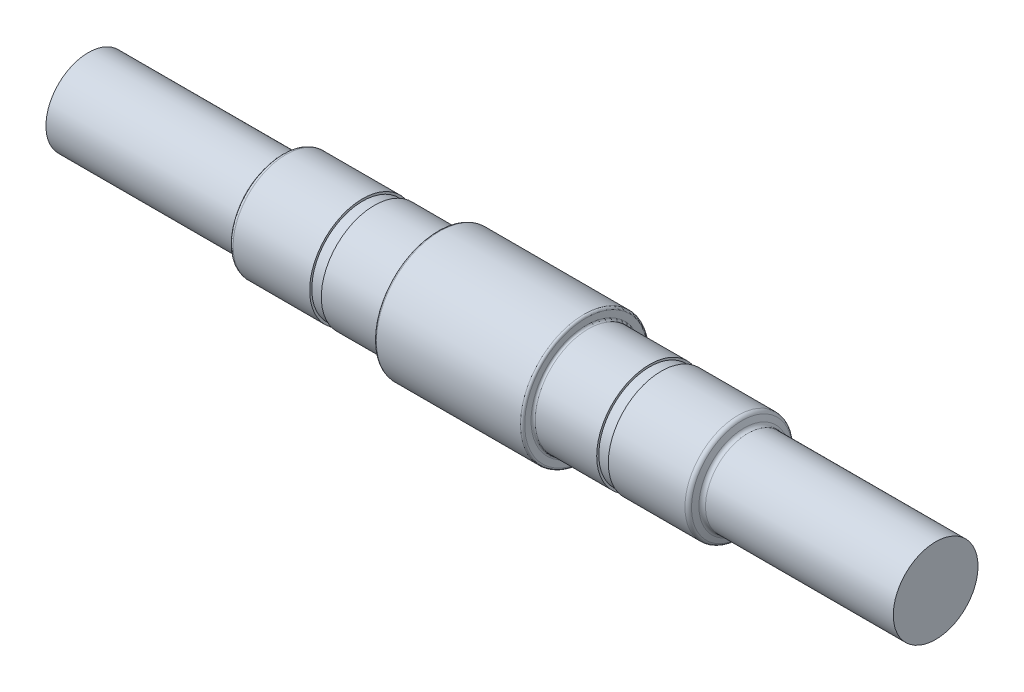
ISO-10303-21;
HEADER;
FILE_DESCRIPTION(('STEP AP214'),'2;1');
FILE_NAME('part.step','',(''),(''),'','','');
FILE_SCHEMA(('AUTOMOTIVE_DESIGN { 1 0 10303 214 1 1 1 1 }'));
ENDSEC;
DATA;
#1=APPLICATION_CONTEXT('core data for automotive mechanical design processes');
#2=APPLICATION_PROTOCOL_DEFINITION('international standard','automotive_design',2000,#1);
#3=PRODUCT_CONTEXT('',#1,'mechanical');
#4=PRODUCT('Part','Part','',(#3));
#5=PRODUCT_RELATED_PRODUCT_CATEGORY('part','',(#4));
#6=PRODUCT_DEFINITION_FORMATION('','',#4);
#7=PRODUCT_DEFINITION_CONTEXT('part definition',#1,'design');
#8=PRODUCT_DEFINITION('design','',#6,#7);
#9=PRODUCT_DEFINITION_SHAPE('','',#8);
#10=(LENGTH_UNIT() NAMED_UNIT(*) SI_UNIT(.MILLI.,.METRE.));
#11=(NAMED_UNIT(*) PLANE_ANGLE_UNIT() SI_UNIT($,.RADIAN.));
#12=(NAMED_UNIT(*) SI_UNIT($,.STERADIAN.) SOLID_ANGLE_UNIT());
#13=UNCERTAINTY_MEASURE_WITH_UNIT(LENGTH_MEASURE(1.E-05),#10,'distance_accuracy_value','');
#14=(GEOMETRIC_REPRESENTATION_CONTEXT(3) GLOBAL_UNCERTAINTY_ASSIGNED_CONTEXT((#13)) GLOBAL_UNIT_ASSIGNED_CONTEXT((#10,
#11,#12)) REPRESENTATION_CONTEXT('',''));
#15=CARTESIAN_POINT('',(0.,0.,0.));
#16=DIRECTION('',(0.,0.,1.));
#17=DIRECTION('',(1.,0.,0.));
#18=AXIS2_PLACEMENT_3D('',#15,#16,#17);
#19=CARTESIAN_POINT('',(-21.6,0.,0.));
#20=DIRECTION('',(1.,0.,0.));
#21=DIRECTION('',(0.,0.,-1.));
#22=AXIS2_PLACEMENT_3D('',#19,#20,#21);
#23=CYLINDRICAL_SURFACE('',#22,5.);
#24=CARTESIAN_POINT('',(-7.2,0.,0.));
#25=DIRECTION('',(-1.,0.,0.));
#26=DIRECTION('',(0.,0.,1.));
#27=AXIS2_PLACEMENT_3D('',#24,#25,#26);
#28=CIRCLE('',#27,5.);
#29=CARTESIAN_POINT('',(-7.2,0.,-5.));
#30=VERTEX_POINT('',#29);
#31=EDGE_CURVE('E58',#30,#30,#28,.T.);
#32=CARTESIAN_POINT('',(-13.,0.,0.));
#33=DIRECTION('',(-1.,0.,0.));
#34=DIRECTION('',(0.,0.,1.));
#35=AXIS2_PLACEMENT_3D('',#32,#33,#34);
#36=CIRCLE('',#35,5.);
#37=CARTESIAN_POINT('',(-13.,0.,-5.));
#38=VERTEX_POINT('',#37);
#39=EDGE_CURVE('E63',#38,#38,#36,.F.);
#40=CARTESIAN_POINT('',(-7.2,0.,-5.));
#41=CARTESIAN_POINT('',(-7.26041666666667,0.,-5.));
#42=CARTESIAN_POINT('',(-7.32083333333333,0.,-5.));
#43=CARTESIAN_POINT('',(-7.44166666666667,0.,-5.));
#44=CARTESIAN_POINT('',(-7.50208333333333,0.,-5.));
#45=CARTESIAN_POINT('',(-7.62291666666667,0.,-5.));
#46=CARTESIAN_POINT('',(-7.68333333333333,0.,-5.));
#47=CARTESIAN_POINT('',(-7.80416666666667,0.,-5.));
#48=CARTESIAN_POINT('',(-7.86458333333333,0.,-5.));
#49=CARTESIAN_POINT('',(-7.98541666666667,0.,-5.));
#50=CARTESIAN_POINT('',(-8.04583333333333,0.,-5.));
#51=CARTESIAN_POINT('',(-8.16666666666667,0.,-5.));
#52=CARTESIAN_POINT('',(-8.22708333333333,0.,-5.));
#53=CARTESIAN_POINT('',(-8.34791666666667,0.,-5.));
#54=CARTESIAN_POINT('',(-8.40833333333333,0.,-5.));
#55=CARTESIAN_POINT('',(-8.52916666666667,0.,-5.));
#56=CARTESIAN_POINT('',(-8.58958333333333,0.,-5.));
#57=CARTESIAN_POINT('',(-8.71041666666667,0.,-5.));
#58=CARTESIAN_POINT('',(-8.77083333333333,0.,-5.));
#59=CARTESIAN_POINT('',(-8.89166666666667,0.,-5.));
#60=CARTESIAN_POINT('',(-8.95208333333333,0.,-5.));
#61=CARTESIAN_POINT('',(-9.07291666666667,0.,-5.));
#62=CARTESIAN_POINT('',(-9.13333333333333,0.,-5.));
#63=CARTESIAN_POINT('',(-9.25416666666667,0.,-5.));
#64=CARTESIAN_POINT('',(-9.31458333333333,0.,-5.));
#65=CARTESIAN_POINT('',(-9.43541666666667,0.,-5.));
#66=CARTESIAN_POINT('',(-9.49583333333333,0.,-5.));
#67=CARTESIAN_POINT('',(-9.61666666666667,0.,-5.));
#68=CARTESIAN_POINT('',(-9.67708333333333,0.,-5.));
#69=CARTESIAN_POINT('',(-9.79791666666667,0.,-5.));
#70=CARTESIAN_POINT('',(-9.85833333333333,0.,-5.));
#71=CARTESIAN_POINT('',(-9.97916666666667,0.,-5.));
#72=CARTESIAN_POINT('',(-10.0395833333333,0.,-5.));
#73=CARTESIAN_POINT('',(-10.1604166666667,0.,-5.));
#74=CARTESIAN_POINT('',(-10.2208333333333,0.,-5.));
#75=CARTESIAN_POINT('',(-10.3416666666667,0.,-5.));
#76=CARTESIAN_POINT('',(-10.4020833333333,0.,-5.));
#77=CARTESIAN_POINT('',(-10.5229166666667,0.,-5.));
#78=CARTESIAN_POINT('',(-10.5833333333333,0.,-5.));
#79=CARTESIAN_POINT('',(-10.7041666666667,0.,-5.));
#80=CARTESIAN_POINT('',(-10.7645833333333,0.,-5.));
#81=CARTESIAN_POINT('',(-10.8854166666667,0.,-5.));
#82=CARTESIAN_POINT('',(-10.9458333333333,0.,-5.));
#83=CARTESIAN_POINT('',(-11.0666666666667,0.,-5.));
#84=CARTESIAN_POINT('',(-11.1270833333333,0.,-5.));
#85=CARTESIAN_POINT('',(-11.2479166666667,0.,-5.));
#86=CARTESIAN_POINT('',(-11.3083333333333,0.,-5.));
#87=CARTESIAN_POINT('',(-11.4291666666667,0.,-5.));
#88=CARTESIAN_POINT('',(-11.4895833333333,0.,-5.));
#89=CARTESIAN_POINT('',(-11.6104166666667,0.,-5.));
#90=CARTESIAN_POINT('',(-11.6708333333333,0.,-5.));
#91=CARTESIAN_POINT('',(-11.7916666666667,0.,-5.));
#92=CARTESIAN_POINT('',(-11.8520833333333,0.,-5.));
#93=CARTESIAN_POINT('',(-11.9729166666667,0.,-5.));
#94=CARTESIAN_POINT('',(-12.0333333333333,0.,-5.));
#95=CARTESIAN_POINT('',(-12.1541666666667,0.,-5.));
#96=CARTESIAN_POINT('',(-12.2145833333333,0.,-5.));
#97=CARTESIAN_POINT('',(-12.3354166666667,0.,-5.));
#98=CARTESIAN_POINT('',(-12.3958333333333,0.,-5.));
#99=CARTESIAN_POINT('',(-12.5166666666667,0.,-5.));
#100=CARTESIAN_POINT('',(-12.5770833333333,0.,-5.));
#101=CARTESIAN_POINT('',(-12.6979166666667,0.,-5.));
#102=CARTESIAN_POINT('',(-12.7583333333333,0.,-5.));
#103=CARTESIAN_POINT('',(-12.8791666666667,0.,-5.));
#104=CARTESIAN_POINT('',(-12.9395833333333,0.,-5.));
#105=CARTESIAN_POINT('',(-13.,0.,-5.));
#106=B_SPLINE_CURVE_WITH_KNOTS('',3,(#40,#41,#42,#43,#44,#45,#46,#47,#48,#49,#50,#51,#52,#53,
#54,#55,#56,#57,#58,#59,#60,#61,#62,#63,#64,#65,#66,#67,#68,#69,#70,#71,#72,#73,#74,#75,#76,#77,
#78,#79,#80,#81,#82,#83,#84,#85,#86,#87,#88,#89,#90,#91,#92,#93,#94,#95,#96,#97,#98,#99,#100,
#101,#102,#103,#104,#105),.UNSPECIFIED.,.F.,.F.,(4,2,2,2,2,2,2,2,2,2,2,2,2,2,2,2,2,2,2,2,2,2,2,
2,2,2,2,2,2,2,2,2,4),(0.,0.181250000000001,0.3625,0.543749999999999,0.725,0.906250000000001,
1.0875,1.26875,1.45,1.63125,1.8125,1.99375,2.175,2.35625,2.5375,2.71875,2.9,3.08125,3.2625,
3.44375,3.625,3.80625,3.9875,4.16875,4.35,4.53125,4.7125,4.89375,5.075,5.25625,5.4375,5.61875,
5.8),.UNSPECIFIED.);
#107=EDGE_CURVE('BSEAM38',#30,#38,#106,.T.);
#108=ORIENTED_EDGE('',*,*,#31,.T.);
#109=ORIENTED_EDGE('',*,*,#39,.T.);
#110=ORIENTED_EDGE('',*,*,#107,.T.);
#111=ORIENTED_EDGE('',*,*,#107,.F.);
#112=EDGE_LOOP('',(#108,#110,#109,#111));
#113=FACE_BOUND('',#112,.T.);
#114=ADVANCED_FACE('F38',(#113),#23,.T.);
#115=CARTESIAN_POINT('',(21.6,0.,0.));
#116=DIRECTION('',(-1.,0.,0.));
#117=DIRECTION('',(0.,0.,1.));
#118=AXIS2_PLACEMENT_3D('',#115,#116,#117);
#119=CYLINDRICAL_SURFACE('',#118,5.);
#120=CARTESIAN_POINT('',(7.2,0.,0.));
#121=DIRECTION('',(1.,0.,0.));
#122=DIRECTION('',(0.,0.,-1.));
#123=AXIS2_PLACEMENT_3D('',#120,#121,#122);
#124=CIRCLE('',#123,5.);
#125=CARTESIAN_POINT('',(7.2,0.,5.));
#126=VERTEX_POINT('',#125);
#127=EDGE_CURVE('E90',#126,#126,#124,.T.);
#128=CARTESIAN_POINT('',(13.,0.,0.));
#129=DIRECTION('',(1.,0.,0.));
#130=DIRECTION('',(0.,0.,-1.));
#131=AXIS2_PLACEMENT_3D('',#128,#129,#130);
#132=CIRCLE('',#131,5.);
#133=CARTESIAN_POINT('',(13.,0.,5.));
#134=VERTEX_POINT('',#133);
#135=EDGE_CURVE('E95',#134,#134,#132,.T.);
#136=CARTESIAN_POINT('',(7.2,0.,5.));
#137=CARTESIAN_POINT('',(7.26041666666667,0.,5.));
#138=CARTESIAN_POINT('',(7.32083333333333,0.,5.));
#139=CARTESIAN_POINT('',(7.44166666666667,0.,5.));
#140=CARTESIAN_POINT('',(7.50208333333333,0.,5.));
#141=CARTESIAN_POINT('',(7.62291666666667,0.,5.));
#142=CARTESIAN_POINT('',(7.68333333333333,0.,5.));
#143=CARTESIAN_POINT('',(7.80416666666667,0.,5.));
#144=CARTESIAN_POINT('',(7.86458333333333,0.,5.));
#145=CARTESIAN_POINT('',(7.98541666666667,0.,5.));
#146=CARTESIAN_POINT('',(8.04583333333333,0.,5.));
#147=CARTESIAN_POINT('',(8.16666666666667,0.,5.));
#148=CARTESIAN_POINT('',(8.22708333333333,0.,5.));
#149=CARTESIAN_POINT('',(8.34791666666667,0.,5.));
#150=CARTESIAN_POINT('',(8.40833333333333,0.,5.));
#151=CARTESIAN_POINT('',(8.52916666666667,0.,5.));
#152=CARTESIAN_POINT('',(8.58958333333333,0.,5.));
#153=CARTESIAN_POINT('',(8.71041666666667,0.,5.));
#154=CARTESIAN_POINT('',(8.77083333333333,0.,5.));
#155=CARTESIAN_POINT('',(8.89166666666667,0.,5.));
#156=CARTESIAN_POINT('',(8.95208333333333,0.,5.));
#157=CARTESIAN_POINT('',(9.07291666666667,0.,5.));
#158=CARTESIAN_POINT('',(9.13333333333333,0.,5.));
#159=CARTESIAN_POINT('',(9.25416666666667,0.,5.));
#160=CARTESIAN_POINT('',(9.31458333333333,0.,5.));
#161=CARTESIAN_POINT('',(9.43541666666667,0.,5.));
#162=CARTESIAN_POINT('',(9.49583333333333,0.,5.));
#163=CARTESIAN_POINT('',(9.61666666666667,0.,5.));
#164=CARTESIAN_POINT('',(9.67708333333333,0.,5.));
#165=CARTESIAN_POINT('',(9.79791666666667,0.,5.));
#166=CARTESIAN_POINT('',(9.85833333333333,0.,5.));
#167=CARTESIAN_POINT('',(9.97916666666667,0.,5.));
#168=CARTESIAN_POINT('',(10.0395833333333,0.,5.));
#169=CARTESIAN_POINT('',(10.1604166666667,0.,5.));
#170=CARTESIAN_POINT('',(10.2208333333333,0.,5.));
#171=CARTESIAN_POINT('',(10.3416666666667,0.,5.));
#172=CARTESIAN_POINT('',(10.4020833333333,0.,5.));
#173=CARTESIAN_POINT('',(10.5229166666667,0.,5.));
#174=CARTESIAN_POINT('',(10.5833333333333,0.,5.));
#175=CARTESIAN_POINT('',(10.7041666666667,0.,5.));
#176=CARTESIAN_POINT('',(10.7645833333333,0.,5.));
#177=CARTESIAN_POINT('',(10.8854166666667,0.,5.));
#178=CARTESIAN_POINT('',(10.9458333333333,0.,5.));
#179=CARTESIAN_POINT('',(11.0666666666667,0.,5.));
#180=CARTESIAN_POINT('',(11.1270833333333,0.,5.));
#181=CARTESIAN_POINT('',(11.2479166666667,0.,5.));
#182=CARTESIAN_POINT('',(11.3083333333333,0.,5.));
#183=CARTESIAN_POINT('',(11.4291666666667,0.,5.));
#184=CARTESIAN_POINT('',(11.4895833333333,0.,5.));
#185=CARTESIAN_POINT('',(11.6104166666667,0.,5.));
#186=CARTESIAN_POINT('',(11.6708333333333,0.,5.));
#187=CARTESIAN_POINT('',(11.7916666666667,0.,5.));
#188=CARTESIAN_POINT('',(11.8520833333333,0.,5.));
#189=CARTESIAN_POINT('',(11.9729166666667,0.,5.));
#190=CARTESIAN_POINT('',(12.0333333333333,0.,5.));
#191=CARTESIAN_POINT('',(12.1541666666667,0.,5.));
#192=CARTESIAN_POINT('',(12.2145833333333,0.,5.));
#193=CARTESIAN_POINT('',(12.3354166666667,0.,5.));
#194=CARTESIAN_POINT('',(12.3958333333333,0.,5.));
#195=CARTESIAN_POINT('',(12.5166666666667,0.,5.));
#196=CARTESIAN_POINT('',(12.5770833333333,0.,5.));
#197=CARTESIAN_POINT('',(12.6979166666667,0.,5.));
#198=CARTESIAN_POINT('',(12.7583333333333,0.,5.));
#199=CARTESIAN_POINT('',(12.8791666666667,0.,5.));
#200=CARTESIAN_POINT('',(12.9395833333333,0.,5.));
#201=CARTESIAN_POINT('',(13.,0.,5.));
#202=B_SPLINE_CURVE_WITH_KNOTS('',3,(#136,#137,#138,#139,#140,#141,#142,#143,#144,#145,#146,
#147,#148,#149,#150,#151,#152,#153,#154,#155,#156,#157,#158,#159,#160,#161,#162,#163,#164,#165,
#166,#167,#168,#169,#170,#171,#172,#173,#174,#175,#176,#177,#178,#179,#180,#181,#182,#183,#184,
#185,#186,#187,#188,#189,#190,#191,#192,#193,#194,#195,#196,#197,#198,#199,#200,#201),
.UNSPECIFIED.,.F.,.F.,(4,2,2,2,2,2,2,2,2,2,2,2,2,2,2,2,2,2,2,2,2,2,2,2,2,2,2,2,2,2,2,2,4),(0.,
0.181250000000001,0.3625,0.543749999999999,0.725,0.906250000000001,1.0875,1.26875,1.45,1.63125,
1.8125,1.99375,2.175,2.35625,2.5375,2.71875,2.9,3.08125,3.2625,3.44375,3.625,3.80625,3.9875,
4.16875,4.35,4.53125,4.7125,4.89375,5.075,5.25625,5.4375,5.61875,5.8),.UNSPECIFIED.);
#203=EDGE_CURVE('BSEAM145',#126,#134,#202,.T.);
#204=ORIENTED_EDGE('',*,*,#127,.T.);
#205=ORIENTED_EDGE('',*,*,#135,.F.);
#206=ORIENTED_EDGE('',*,*,#203,.T.);
#207=ORIENTED_EDGE('',*,*,#203,.F.);
#208=EDGE_LOOP('',(#204,#206,#205,#207));
#209=FACE_BOUND('',#208,.T.);
#210=ADVANCED_FACE('F145',(#209),#119,.T.);
#211=CARTESIAN_POINT('',(7.,0.,0.));
#212=DIRECTION('',(-1.,0.,0.));
#213=DIRECTION('',(0.,0.,1.));
#214=AXIS2_PLACEMENT_3D('',#211,#212,#213);
#215=CYLINDRICAL_SURFACE('',#214,6.);
#216=CARTESIAN_POINT('',(-6.8,0.,0.));
#217=DIRECTION('',(-1.,0.,0.));
#218=DIRECTION('',(0.,0.,1.));
#219=AXIS2_PLACEMENT_3D('',#216,#217,#218);
#220=CIRCLE('',#219,6.);
#221=CARTESIAN_POINT('',(-6.8,0.,6.));
#222=VERTEX_POINT('',#221);
#223=EDGE_CURVE('E75',#222,#222,#220,.F.);
#224=ORIENTED_EDGE('',*,*,#223,.T.);
#225=EDGE_LOOP('',(#224));
#226=FACE_BOUND('',#225,.T.);
#227=CARTESIAN_POINT('',(6.8,0.,0.));
#228=DIRECTION('',(1.,0.,0.));
#229=DIRECTION('',(0.,0.,-1.));
#230=AXIS2_PLACEMENT_3D('',#227,#228,#229);
#231=CIRCLE('',#230,6.);
#232=CARTESIAN_POINT('',(6.8,0.,-6.));
#233=VERTEX_POINT('',#232);
#234=EDGE_CURVE('E101',#233,#233,#231,.F.);
#235=ORIENTED_EDGE('',*,*,#234,.T.);
#236=EDGE_LOOP('',(#235));
#237=FACE_BOUND('',#236,.T.);
#238=ADVANCED_FACE('F152',(#226,#237),#215,.T.);
#239=CARTESIAN_POINT('',(7.,0.,0.));
#240=DIRECTION('',(1.,0.,0.));
#241=DIRECTION('',(0.,0.,-1.));
#242=AXIS2_PLACEMENT_3D('',#239,#240,#241);
#243=PLANE('',#242);
#244=CARTESIAN_POINT('',(7.,0.,0.));
#245=DIRECTION('',(1.,0.,0.));
#246=DIRECTION('',(0.,0.,-1.));
#247=AXIS2_PLACEMENT_3D('',#244,#245,#246);
#248=CIRCLE('',#247,5.8);
#249=CARTESIAN_POINT('',(7.,0.,-5.8));
#250=VERTEX_POINT('',#249);
#251=EDGE_CURVE('E104',#250,#250,#248,.T.);
#252=ORIENTED_EDGE('',*,*,#251,.T.);
#253=EDGE_LOOP('',(#252));
#254=FACE_BOUND('',#253,.T.);
#255=CARTESIAN_POINT('',(7.,0.,0.));
#256=DIRECTION('',(1.,0.,0.));
#257=DIRECTION('',(0.,0.,-1.));
#258=AXIS2_PLACEMENT_3D('',#255,#256,#257);
#259=CIRCLE('',#258,5.2);
#260=CARTESIAN_POINT('',(7.,0.,-5.2));
#261=VERTEX_POINT('',#260);
#262=EDGE_CURVE('E107',#261,#261,#259,.F.);
#263=ORIENTED_EDGE('',*,*,#262,.T.);
#264=EDGE_LOOP('',(#263));
#265=FACE_BOUND('',#264,.T.);
#266=ADVANCED_FACE('F305',(#254,#265),#243,.T.);
#267=CARTESIAN_POINT('',(6.8,0.,0.));
#268=DIRECTION('',(1.,0.,0.));
#269=DIRECTION('',(0.,0.,-1.));
#270=AXIS2_PLACEMENT_3D('',#267,#268,#269);
#271=TOROIDAL_SURFACE('',#270,5.8,0.2);
#272=ORIENTED_EDGE('',*,*,#234,.F.);
#273=EDGE_LOOP('',(#272));
#274=FACE_BOUND('',#273,.T.);
#275=ORIENTED_EDGE('',*,*,#251,.F.);
#276=EDGE_LOOP('',(#275));
#277=FACE_BOUND('',#276,.T.);
#278=ADVANCED_FACE('F318',(#274,#277),#271,.T.);
#279=CARTESIAN_POINT('',(7.2,0.,0.));
#280=DIRECTION('',(1.,0.,0.));
#281=DIRECTION('',(0.,0.,-1.));
#282=AXIS2_PLACEMENT_3D('',#279,#280,#281);
#283=TOROIDAL_SURFACE('',#282,5.2,0.2);
#284=ORIENTED_EDGE('',*,*,#127,.F.);
#285=EDGE_LOOP('',(#284));
#286=FACE_BOUND('',#285,.T.);
#287=ORIENTED_EDGE('',*,*,#262,.F.);
#288=EDGE_LOOP('',(#287));
#289=FACE_BOUND('',#288,.T.);
#290=ADVANCED_FACE('F327',(#286,#289),#283,.F.);
#291=CARTESIAN_POINT('',(14.1,0.,0.));
#292=DIRECTION('',(1.,0.,0.));
#293=DIRECTION('',(0.,0.,-1.));
#294=AXIS2_PLACEMENT_3D('',#291,#292,#293);
#295=PLANE('',#294);
#296=CARTESIAN_POINT('',(14.1,0.,0.));
#297=DIRECTION('',(1.,0.,0.));
#298=DIRECTION('',(0.,0.,-1.));
#299=AXIS2_PLACEMENT_3D('',#296,#297,#298);
#300=CIRCLE('',#299,4.8);
#301=CARTESIAN_POINT('',(14.1,0.,-4.8));
#302=VERTEX_POINT('',#301);
#303=EDGE_CURVE('E98',#302,#302,#300,.T.);
#304=ORIENTED_EDGE('',*,*,#303,.T.);
#305=EDGE_LOOP('',(#304));
#306=FACE_BOUND('',#305,.T.);
#307=CARTESIAN_POINT('',(14.1,0.,0.));
#308=DIRECTION('',(1.,0.,0.));
#309=DIRECTION('',(0.,0.,-1.));
#310=AXIS2_PLACEMENT_3D('',#307,#308,#309);
#311=CIRCLE('',#310,5.);
#312=CARTESIAN_POINT('',(14.1,0.,5.));
#313=VERTEX_POINT('',#312);
#314=EDGE_CURVE('E91',#313,#313,#311,.T.);
#315=ORIENTED_EDGE('',*,*,#314,.F.);
#316=EDGE_LOOP('',(#315));
#317=FACE_BOUND('',#316,.T.);
#318=ADVANCED_FACE('F335',(#306,#317),#295,.F.);
#319=CARTESIAN_POINT('',(13.,0.,0.));
#320=DIRECTION('',(1.,0.,0.));
#321=DIRECTION('',(0.,0.,-1.));
#322=AXIS2_PLACEMENT_3D('',#319,#320,#321);
#323=PLANE('',#322);
#324=CARTESIAN_POINT('',(13.,0.,0.));
#325=DIRECTION('',(1.,0.,0.));
#326=DIRECTION('',(0.,0.,-1.));
#327=AXIS2_PLACEMENT_3D('',#324,#325,#326);
#328=CIRCLE('',#327,4.8);
#329=CARTESIAN_POINT('',(13.,0.,-4.8));
#330=VERTEX_POINT('',#329);
#331=EDGE_CURVE('E112',#330,#330,#328,.T.);
#332=ORIENTED_EDGE('',*,*,#331,.F.);
#333=EDGE_LOOP('',(#332));
#334=FACE_BOUND('',#333,.T.);
#335=ORIENTED_EDGE('',*,*,#135,.T.);
#336=EDGE_LOOP('',(#335));
#337=FACE_BOUND('',#336,.T.);
#338=ADVANCED_FACE('F343',(#334,#337),#323,.T.);
#339=CARTESIAN_POINT('',(14.1,0.,0.));
#340=DIRECTION('',(-1.,0.,0.));
#341=DIRECTION('',(0.,0.,1.));
#342=AXIS2_PLACEMENT_3D('',#339,#340,#341);
#343=CYLINDRICAL_SURFACE('',#342,4.8);
#344=ORIENTED_EDGE('',*,*,#303,.F.);
#345=EDGE_LOOP('',(#344));
#346=FACE_BOUND('',#345,.T.);
#347=ORIENTED_EDGE('',*,*,#331,.T.);
#348=EDGE_LOOP('',(#347));
#349=FACE_BOUND('',#348,.T.);
#350=ADVANCED_FACE('F351',(#346,#349),#343,.T.);
#351=CARTESIAN_POINT('',(21.330196593263,0.,0.));
#352=DIRECTION('',(-1.,0.,0.));
#353=DIRECTION('',(0.,0.,1.));
#354=AXIS2_PLACEMENT_3D('',#351,#352,#353);
#355=CIRCLE('',#354,5.);
#356=CARTESIAN_POINT('',(21.330196593263,0.,5.));
#357=VERTEX_POINT('',#356);
#358=EDGE_CURVE('E78',#357,#357,#355,.T.);
#359=CARTESIAN_POINT('',(21.330196593263,0.,5.));
#360=CARTESIAN_POINT('',(21.2548820454165,0.,5.));
#361=CARTESIAN_POINT('',(21.1795674975701,0.,5.));
#362=CARTESIAN_POINT('',(21.0289384018771,0.,5.));
#363=CARTESIAN_POINT('',(20.9536238540306,0.,5.));
#364=CARTESIAN_POINT('',(20.8029947583376,0.,5.));
#365=CARTESIAN_POINT('',(20.7276802104911,0.,5.));
#366=CARTESIAN_POINT('',(20.5770511147981,0.,5.));
#367=CARTESIAN_POINT('',(20.5017365669516,0.,5.));
#368=CARTESIAN_POINT('',(20.3511074712587,0.,5.));
#369=CARTESIAN_POINT('',(20.2757929234122,0.,5.));
#370=CARTESIAN_POINT('',(20.1251638277192,0.,5.));
#371=CARTESIAN_POINT('',(20.0498492798727,0.,5.));
#372=CARTESIAN_POINT('',(19.8992201841797,0.,5.));
#373=CARTESIAN_POINT('',(19.8239056363332,0.,5.));
#374=CARTESIAN_POINT('',(19.6732765406403,0.,5.));
#375=CARTESIAN_POINT('',(19.5979619927938,0.,5.));
#376=CARTESIAN_POINT('',(19.4473328971008,0.,5.));
#377=CARTESIAN_POINT('',(19.3720183492543,0.,5.));
#378=CARTESIAN_POINT('',(19.2213892535613,0.,5.));
#379=CARTESIAN_POINT('',(19.1460747057148,0.,5.));
#380=CARTESIAN_POINT('',(18.9954456100219,0.,5.));
#381=CARTESIAN_POINT('',(18.9201310621754,0.,5.));
#382=CARTESIAN_POINT('',(18.7695019664824,0.,5.));
#383=CARTESIAN_POINT('',(18.6941874186359,0.,5.));
#384=CARTESIAN_POINT('',(18.5435583229429,0.,5.));
#385=CARTESIAN_POINT('',(18.4682437750964,0.,5.));
#386=CARTESIAN_POINT('',(18.3176146794034,0.,5.));
#387=CARTESIAN_POINT('',(18.2423001315569,0.,5.));
#388=CARTESIAN_POINT('',(18.091671035864,0.,5.));
#389=CARTESIAN_POINT('',(18.0163564880175,0.,5.));
#390=CARTESIAN_POINT('',(17.8657273923245,0.,5.));
#391=CARTESIAN_POINT('',(17.790412844478,0.,5.));
#392=CARTESIAN_POINT('',(17.639783748785,0.,5.));
#393=CARTESIAN_POINT('',(17.5644692009385,0.,5.));
#394=CARTESIAN_POINT('',(17.4138401052456,0.,5.));
#395=CARTESIAN_POINT('',(17.3385255573991,0.,5.));
#396=CARTESIAN_POINT('',(17.1878964617061,0.,5.));
#397=CARTESIAN_POINT('',(17.1125819138596,0.,5.));
#398=CARTESIAN_POINT('',(16.9619528181666,0.,5.));
#399=CARTESIAN_POINT('',(16.8866382703201,0.,5.));
#400=CARTESIAN_POINT('',(16.7360091746271,0.,5.));
#401=CARTESIAN_POINT('',(16.6606946267807,0.,5.));
#402=CARTESIAN_POINT('',(16.5100655310877,0.,5.));
#403=CARTESIAN_POINT('',(16.4347509832412,0.,5.));
#404=CARTESIAN_POINT('',(16.2841218875482,0.,5.));
#405=CARTESIAN_POINT('',(16.2088073397017,0.,5.));
#406=CARTESIAN_POINT('',(16.0581782440087,0.,5.));
#407=CARTESIAN_POINT('',(15.9828636961622,0.,5.));
#408=CARTESIAN_POINT('',(15.8322346004693,0.,5.));
#409=CARTESIAN_POINT('',(15.7569200526228,0.,5.));
#410=CARTESIAN_POINT('',(15.6062909569298,0.,5.));
#411=CARTESIAN_POINT('',(15.5309764090833,0.,5.));
#412=CARTESIAN_POINT('',(15.3803473133903,0.,5.));
#413=CARTESIAN_POINT('',(15.3050327655438,0.,5.));
#414=CARTESIAN_POINT('',(15.1544036698509,0.,5.));
#415=CARTESIAN_POINT('',(15.0790891220044,0.,5.));
#416=CARTESIAN_POINT('',(14.9284600263114,0.,5.));
#417=CARTESIAN_POINT('',(14.8531454784649,0.,5.));
#418=CARTESIAN_POINT('',(14.7025163827719,0.,5.));
#419=CARTESIAN_POINT('',(14.6272018349254,0.,5.));
#420=CARTESIAN_POINT('',(14.4765727392325,0.,5.));
#421=CARTESIAN_POINT('',(14.401258191386,0.,5.));
#422=CARTESIAN_POINT('',(14.250629095693,0.,5.));
#423=CARTESIAN_POINT('',(14.1753145478465,0.,5.));
#424=CARTESIAN_POINT('',(14.1,0.,5.));
#425=B_SPLINE_CURVE_WITH_KNOTS('',3,(#359,#360,#361,#362,#363,#364,#365,#366,#367,#368,#369,
#370,#371,#372,#373,#374,#375,#376,#377,#378,#379,#380,#381,#382,#383,#384,#385,#386,#387,#388,
#389,#390,#391,#392,#393,#394,#395,#396,#397,#398,#399,#400,#401,#402,#403,#404,#405,#406,#407,
#408,#409,#410,#411,#412,#413,#414,#415,#416,#417,#418,#419,#420,#421,#422,#423,#424),
.UNSPECIFIED.,.F.,.F.,(4,2,2,2,2,2,2,2,2,2,2,2,2,2,2,2,2,2,2,2,2,2,2,2,2,2,2,2,2,2,2,2,4),(0.,
0.225943643539468,0.451887287078939,0.677830930618409,0.903774574157877,1.12971821769735,
1.35566186123682,1.58160550477629,1.80754914831576,2.03349279185523,2.2594364353947,
2.48538007893417,2.71132372247364,2.93726736601311,3.16321100955258,3.38915465309205,
3.61509829663152,3.84104194017099,4.06698558371046,4.29292922724992,4.5188728707894,
4.74481651432887,4.97076015786833,5.19670380140781,5.42264744494728,5.64859108848674,
5.87453473202621,6.10047837556569,6.32642201910515,6.55236566264462,6.7783093061841,
7.00425294972356,7.23019659326303),.UNSPECIFIED.);
#426=EDGE_CURVE('BSEAM155',#357,#313,#425,.T.);
#427=ORIENTED_EDGE('',*,*,#358,.T.);
#428=ORIENTED_EDGE('',*,*,#314,.T.);
#429=ORIENTED_EDGE('',*,*,#426,.T.);
#430=ORIENTED_EDGE('',*,*,#426,.F.);
#431=EDGE_LOOP('',(#427,#429,#428,#430));
#432=FACE_BOUND('',#431,.T.);
#433=ADVANCED_FACE('F155',(#432),#119,.T.);
#434=CARTESIAN_POINT('',(22.0040262258352,0.,0.));
#435=DIRECTION('',(-1.,0.,0.));
#436=DIRECTION('',(0.,0.,1.));
#437=AXIS2_PLACEMENT_3D('',#434,#435,#436);
#438=CONICAL_SURFACE('',#437,4.,1.18682389135614);
#439=CARTESIAN_POINT('',(21.9029560907454,0.,0.));
#440=DIRECTION('',(1.,0.,0.));
#441=DIRECTION('',(0.,0.,-1.));
#442=AXIS2_PLACEMENT_3D('',#439,#440,#441);
#443=CIRCLE('',#442,4.25015736263363);
#444=CARTESIAN_POINT('',(21.9029560907454,0.,-4.25015736263363));
#445=VERTEX_POINT('',#444);
#446=EDGE_CURVE('E81',#445,#445,#443,.F.);
#447=ORIENTED_EDGE('',*,*,#446,.T.);
#448=EDGE_LOOP('',(#447));
#449=FACE_BOUND('',#448,.T.);
#450=CARTESIAN_POINT('',(21.7010701350897,0.,0.));
#451=DIRECTION('',(-1.,0.,0.));
#452=DIRECTION('',(0.,0.,1.));
#453=AXIS2_PLACEMENT_3D('',#450,#451,#452);
#454=CIRCLE('',#453,4.74984263736637);
#455=CARTESIAN_POINT('',(21.7010701350897,0.,4.74984263736637));
#456=VERTEX_POINT('',#455);
#457=EDGE_CURVE('E84',#456,#456,#454,.F.);
#458=ORIENTED_EDGE('',*,*,#457,.T.);
#459=EDGE_LOOP('',(#458));
#460=FACE_BOUND('',#459,.T.);
#461=ADVANCED_FACE('F366',(#449,#460),#438,.T.);
#462=CARTESIAN_POINT('',(40.,0.,0.));
#463=DIRECTION('',(1.,0.,0.));
#464=DIRECTION('',(0.,0.,-1.));
#465=AXIS2_PLACEMENT_3D('',#462,#463,#464);
#466=PLANE('',#465);
#467=CARTESIAN_POINT('',(40.,0.,0.));
#468=DIRECTION('',(1.,0.,0.));
#469=DIRECTION('',(0.,0.,-1.));
#470=AXIS2_PLACEMENT_3D('',#467,#468,#469);
#471=CIRCLE('',#470,4.);
#472=CARTESIAN_POINT('',(40.,0.,-4.));
#473=VERTEX_POINT('',#472);
#474=EDGE_CURVE('E94',#473,#473,#471,.T.);
#475=ORIENTED_EDGE('',*,*,#474,.T.);
#476=EDGE_LOOP('',(#475));
#477=FACE_BOUND('',#476,.T.);
#478=ADVANCED_FACE('F246',(#477),#466,.T.);
#479=CARTESIAN_POINT('',(40.,0.,0.));
#480=DIRECTION('',(-1.,0.,0.));
#481=DIRECTION('',(0.,0.,1.));
#482=AXIS2_PLACEMENT_3D('',#479,#480,#481);
#483=CYLINDRICAL_SURFACE('',#482,4.);
#484=CARTESIAN_POINT('',(22.2738296325721,0.,0.));
#485=DIRECTION('',(1.,0.,0.));
#486=DIRECTION('',(0.,0.,-1.));
#487=AXIS2_PLACEMENT_3D('',#484,#485,#486);
#488=CIRCLE('',#487,4.);
#489=CARTESIAN_POINT('',(22.2738296325721,0.,-4.));
#490=VERTEX_POINT('',#489);
#491=EDGE_CURVE('E87',#490,#490,#488,.T.);
#492=ORIENTED_EDGE('',*,*,#491,.T.);
#493=EDGE_LOOP('',(#492));
#494=FACE_BOUND('',#493,.T.);
#495=ORIENTED_EDGE('',*,*,#474,.F.);
#496=EDGE_LOOP('',(#495));
#497=FACE_BOUND('',#496,.T.);
#498=ADVANCED_FACE('F240',(#494,#497),#483,.T.);
#499=CARTESIAN_POINT('',(22.2738296325721,0.,0.));
#500=DIRECTION('',(1.,0.,0.));
#501=DIRECTION('',(0.,0.,-1.));
#502=AXIS2_PLACEMENT_3D('',#499,#500,#501);
#503=TOROIDAL_SURFACE('',#502,4.4,0.4);
#504=ORIENTED_EDGE('',*,*,#446,.F.);
#505=EDGE_LOOP('',(#504));
#506=FACE_BOUND('',#505,.T.);
#507=ORIENTED_EDGE('',*,*,#491,.F.);
#508=EDGE_LOOP('',(#507));
#509=FACE_BOUND('',#508,.T.);
#510=ADVANCED_FACE('F245',(#506,#509),#503,.F.);
#511=CARTESIAN_POINT('',(21.330196593263,0.,0.));
#512=DIRECTION('',(-1.,0.,0.));
#513=DIRECTION('',(0.,0.,1.));
#514=AXIS2_PLACEMENT_3D('',#511,#512,#513);
#515=TOROIDAL_SURFACE('',#514,4.6,0.4);
#516=ORIENTED_EDGE('',*,*,#358,.F.);
#517=EDGE_LOOP('',(#516));
#518=FACE_BOUND('',#517,.T.);
#519=ORIENTED_EDGE('',*,*,#457,.F.);
#520=EDGE_LOOP('',(#519));
#521=FACE_BOUND('',#520,.T.);
#522=ADVANCED_FACE('F190',(#518,#521),#515,.T.);
#523=CARTESIAN_POINT('',(-7.,0.,0.));
#524=DIRECTION('',(-1.,0.,0.));
#525=DIRECTION('',(0.,0.,-1.));
#526=AXIS2_PLACEMENT_3D('',#523,#524,#525);
#527=PLANE('',#526);
#528=CARTESIAN_POINT('',(-7.,0.,0.));
#529=DIRECTION('',(-1.,0.,0.));
#530=DIRECTION('',(0.,0.,1.));
#531=AXIS2_PLACEMENT_3D('',#528,#529,#530);
#532=CIRCLE('',#531,5.8);
#533=CARTESIAN_POINT('',(-7.,0.,5.8));
#534=VERTEX_POINT('',#533);
#535=EDGE_CURVE('E69',#534,#534,#532,.T.);
#536=ORIENTED_EDGE('',*,*,#535,.T.);
#537=EDGE_LOOP('',(#536));
#538=FACE_BOUND('',#537,.T.);
#539=CARTESIAN_POINT('',(-7.,0.,0.));
#540=DIRECTION('',(-1.,0.,0.));
#541=DIRECTION('',(0.,0.,1.));
#542=AXIS2_PLACEMENT_3D('',#539,#540,#541);
#543=CIRCLE('',#542,5.2);
#544=CARTESIAN_POINT('',(-7.,0.,5.2));
#545=VERTEX_POINT('',#544);
#546=EDGE_CURVE('E72',#545,#545,#543,.F.);
#547=ORIENTED_EDGE('',*,*,#546,.T.);
#548=EDGE_LOOP('',(#547));
#549=FACE_BOUND('',#548,.T.);
#550=ADVANCED_FACE('F186',(#538,#549),#527,.T.);
#551=CARTESIAN_POINT('',(-6.8,0.,0.));
#552=DIRECTION('',(-1.,0.,0.));
#553=DIRECTION('',(0.,0.,1.));
#554=AXIS2_PLACEMENT_3D('',#551,#552,#553);
#555=TOROIDAL_SURFACE('',#554,5.8,0.2);
#556=ORIENTED_EDGE('',*,*,#535,.F.);
#557=EDGE_LOOP('',(#556));
#558=FACE_BOUND('',#557,.T.);
#559=ORIENTED_EDGE('',*,*,#223,.F.);
#560=EDGE_LOOP('',(#559));
#561=FACE_BOUND('',#560,.T.);
#562=ADVANCED_FACE('F140',(#558,#561),#555,.T.);
#563=CARTESIAN_POINT('',(-7.2,0.,0.));
#564=DIRECTION('',(-1.,0.,0.));
#565=DIRECTION('',(0.,0.,1.));
#566=AXIS2_PLACEMENT_3D('',#563,#564,#565);
#567=TOROIDAL_SURFACE('',#566,5.2,0.2);
#568=ORIENTED_EDGE('',*,*,#546,.F.);
#569=EDGE_LOOP('',(#568));
#570=FACE_BOUND('',#569,.T.);
#571=ORIENTED_EDGE('',*,*,#31,.F.);
#572=EDGE_LOOP('',(#571));
#573=FACE_BOUND('',#572,.T.);
#574=ADVANCED_FACE('F131',(#570,#573),#567,.F.);
#575=CARTESIAN_POINT('',(-14.1,0.,0.));
#576=DIRECTION('',(-1.,0.,0.));
#577=DIRECTION('',(0.,0.,-1.));
#578=AXIS2_PLACEMENT_3D('',#575,#576,#577);
#579=PLANE('',#578);
#580=CARTESIAN_POINT('',(-14.1,0.,0.));
#581=DIRECTION('',(-1.,0.,0.));
#582=DIRECTION('',(0.,0.,1.));
#583=AXIS2_PLACEMENT_3D('',#580,#581,#582);
#584=CIRCLE('',#583,5.);
#585=CARTESIAN_POINT('',(-14.1,0.,-5.));
#586=VERTEX_POINT('',#585);
#587=EDGE_CURVE('E59',#586,#586,#584,.F.);
#588=ORIENTED_EDGE('',*,*,#587,.T.);
#589=EDGE_LOOP('',(#588));
#590=FACE_BOUND('',#589,.T.);
#591=CARTESIAN_POINT('',(-14.1,0.,0.));
#592=DIRECTION('',(1.,0.,0.));
#593=DIRECTION('',(0.,0.,-1.));
#594=AXIS2_PLACEMENT_3D('',#591,#592,#593);
#595=CIRCLE('',#594,4.8);
#596=CARTESIAN_POINT('',(-14.1,0.,-4.8));
#597=VERTEX_POINT('',#596);
#598=EDGE_CURVE('E66',#597,#597,#595,.T.);
#599=ORIENTED_EDGE('',*,*,#598,.F.);
#600=EDGE_LOOP('',(#599));
#601=FACE_BOUND('',#600,.T.);
#602=ADVANCED_FACE('F128',(#590,#601),#579,.F.);
#603=CARTESIAN_POINT('',(-13.,0.,0.));
#604=DIRECTION('',(-1.,0.,0.));
#605=DIRECTION('',(0.,0.,-1.));
#606=AXIS2_PLACEMENT_3D('',#603,#604,#605);
#607=PLANE('',#606);
#608=ORIENTED_EDGE('',*,*,#39,.F.);
#609=EDGE_LOOP('',(#608));
#610=FACE_BOUND('',#609,.T.);
#611=CARTESIAN_POINT('',(-13.,0.,0.));
#612=DIRECTION('',(1.,0.,0.));
#613=DIRECTION('',(0.,0.,-1.));
#614=AXIS2_PLACEMENT_3D('',#611,#612,#613);
#615=CIRCLE('',#614,4.8);
#616=CARTESIAN_POINT('',(-13.,0.,-4.8));
#617=VERTEX_POINT('',#616);
#618=EDGE_CURVE('E119',#617,#617,#615,.T.);
#619=ORIENTED_EDGE('',*,*,#618,.T.);
#620=EDGE_LOOP('',(#619));
#621=FACE_BOUND('',#620,.T.);
#622=ADVANCED_FACE('F130',(#610,#621),#607,.T.);
#623=CARTESIAN_POINT('',(-14.1,0.,0.));
#624=DIRECTION('',(1.,0.,0.));
#625=DIRECTION('',(0.,0.,-1.));
#626=AXIS2_PLACEMENT_3D('',#623,#624,#625);
#627=CYLINDRICAL_SURFACE('',#626,4.8);
#628=ORIENTED_EDGE('',*,*,#598,.T.);
#629=EDGE_LOOP('',(#628));
#630=FACE_BOUND('',#629,.T.);
#631=ORIENTED_EDGE('',*,*,#618,.F.);
#632=EDGE_LOOP('',(#631));
#633=FACE_BOUND('',#632,.T.);
#634=ADVANCED_FACE('F125',(#630,#633),#627,.T.);
#635=CARTESIAN_POINT('',(-21.330196593263,0.,0.));
#636=DIRECTION('',(-1.,0.,0.));
#637=DIRECTION('',(0.,0.,1.));
#638=AXIS2_PLACEMENT_3D('',#635,#636,#637);
#639=CIRCLE('',#638,5.);
#640=CARTESIAN_POINT('',(-21.330196593263,0.,-5.));
#641=VERTEX_POINT('',#640);
#642=EDGE_CURVE('E10',#641,#641,#639,.F.);
#643=CARTESIAN_POINT('',(-21.330196593263,0.,-5.));
#644=CARTESIAN_POINT('',(-21.2548820454165,0.,-5.));
#645=CARTESIAN_POINT('',(-21.1795674975701,0.,-5.));
#646=CARTESIAN_POINT('',(-21.0289384018771,0.,-5.));
#647=CARTESIAN_POINT('',(-20.9536238540306,0.,-5.));
#648=CARTESIAN_POINT('',(-20.8029947583376,0.,-5.));
#649=CARTESIAN_POINT('',(-20.7276802104911,0.,-5.));
#650=CARTESIAN_POINT('',(-20.5770511147981,0.,-5.));
#651=CARTESIAN_POINT('',(-20.5017365669516,0.,-5.));
#652=CARTESIAN_POINT('',(-20.3511074712587,0.,-5.));
#653=CARTESIAN_POINT('',(-20.2757929234122,0.,-5.));
#654=CARTESIAN_POINT('',(-20.1251638277192,0.,-5.));
#655=CARTESIAN_POINT('',(-20.0498492798727,0.,-5.));
#656=CARTESIAN_POINT('',(-19.8992201841797,0.,-5.));
#657=CARTESIAN_POINT('',(-19.8239056363332,0.,-5.));
#658=CARTESIAN_POINT('',(-19.6732765406403,0.,-5.));
#659=CARTESIAN_POINT('',(-19.5979619927938,0.,-5.));
#660=CARTESIAN_POINT('',(-19.4473328971008,0.,-5.));
#661=CARTESIAN_POINT('',(-19.3720183492543,0.,-5.));
#662=CARTESIAN_POINT('',(-19.2213892535613,0.,-5.));
#663=CARTESIAN_POINT('',(-19.1460747057148,0.,-5.));
#664=CARTESIAN_POINT('',(-18.9954456100218,0.,-5.));
#665=CARTESIAN_POINT('',(-18.9201310621754,0.,-5.));
#666=CARTESIAN_POINT('',(-18.7695019664824,0.,-5.));
#667=CARTESIAN_POINT('',(-18.6941874186359,0.,-5.));
#668=CARTESIAN_POINT('',(-18.5435583229429,0.,-5.));
#669=CARTESIAN_POINT('',(-18.4682437750964,0.,-5.));
#670=CARTESIAN_POINT('',(-18.3176146794034,0.,-5.));
#671=CARTESIAN_POINT('',(-18.2423001315569,0.,-5.));
#672=CARTESIAN_POINT('',(-18.091671035864,0.,-5.));
#673=CARTESIAN_POINT('',(-18.0163564880175,0.,-5.));
#674=CARTESIAN_POINT('',(-17.8657273923245,0.,-5.));
#675=CARTESIAN_POINT('',(-17.790412844478,0.,-5.));
#676=CARTESIAN_POINT('',(-17.639783748785,0.,-5.));
#677=CARTESIAN_POINT('',(-17.5644692009385,0.,-5.));
#678=CARTESIAN_POINT('',(-17.4138401052456,0.,-5.));
#679=CARTESIAN_POINT('',(-17.3385255573991,0.,-5.));
#680=CARTESIAN_POINT('',(-17.1878964617061,0.,-5.));
#681=CARTESIAN_POINT('',(-17.1125819138596,0.,-5.));
#682=CARTESIAN_POINT('',(-16.9619528181666,0.,-5.));
#683=CARTESIAN_POINT('',(-16.8866382703201,0.,-5.));
#684=CARTESIAN_POINT('',(-16.7360091746271,0.,-5.));
#685=CARTESIAN_POINT('',(-16.6606946267807,0.,-5.));
#686=CARTESIAN_POINT('',(-16.5100655310877,0.,-5.));
#687=CARTESIAN_POINT('',(-16.4347509832412,0.,-5.));
#688=CARTESIAN_POINT('',(-16.2841218875482,0.,-5.));
#689=CARTESIAN_POINT('',(-16.2088073397017,0.,-5.));
#690=CARTESIAN_POINT('',(-16.0581782440087,0.,-5.));
#691=CARTESIAN_POINT('',(-15.9828636961622,0.,-5.));
#692=CARTESIAN_POINT('',(-15.8322346004693,0.,-5.));
#693=CARTESIAN_POINT('',(-15.7569200526228,0.,-5.));
#694=CARTESIAN_POINT('',(-15.6062909569298,0.,-5.));
#695=CARTESIAN_POINT('',(-15.5309764090833,0.,-5.));
#696=CARTESIAN_POINT('',(-15.3803473133903,0.,-5.));
#697=CARTESIAN_POINT('',(-15.3050327655438,0.,-5.));
#698=CARTESIAN_POINT('',(-15.1544036698509,0.,-5.));
#699=CARTESIAN_POINT('',(-15.0790891220044,0.,-5.));
#700=CARTESIAN_POINT('',(-14.9284600263114,0.,-5.));
#701=CARTESIAN_POINT('',(-14.8531454784649,0.,-5.));
#702=CARTESIAN_POINT('',(-14.7025163827719,0.,-5.));
#703=CARTESIAN_POINT('',(-14.6272018349254,0.,-5.));
#704=CARTESIAN_POINT('',(-14.4765727392325,0.,-5.));
#705=CARTESIAN_POINT('',(-14.401258191386,0.,-5.));
#706=CARTESIAN_POINT('',(-14.250629095693,0.,-5.));
#707=CARTESIAN_POINT('',(-14.1753145478465,0.,-5.));
#708=CARTESIAN_POINT('',(-14.1,0.,-5.));
#709=B_SPLINE_CURVE_WITH_KNOTS('',3,(#643,#644,#645,#646,#647,#648,#649,#650,#651,#652,#653,
#654,#655,#656,#657,#658,#659,#660,#661,#662,#663,#664,#665,#666,#667,#668,#669,#670,#671,#672,
#673,#674,#675,#676,#677,#678,#679,#680,#681,#682,#683,#684,#685,#686,#687,#688,#689,#690,#691,
#692,#693,#694,#695,#696,#697,#698,#699,#700,#701,#702,#703,#704,#705,#706,#707,#708),
.UNSPECIFIED.,.F.,.F.,(4,2,2,2,2,2,2,2,2,2,2,2,2,2,2,2,2,2,2,2,2,2,2,2,2,2,2,2,2,2,2,2,4),(0.,
0.225943643539471,0.451887287078942,0.677830930618409,0.903774574157881,1.12971821769735,
1.35566186123682,1.58160550477629,1.80754914831576,2.03349279185523,2.2594364353947,
2.48538007893417,2.71132372247364,2.93726736601311,3.16321100955258,3.38915465309205,
3.61509829663152,3.84104194017099,4.06698558371046,4.29292922724993,4.5188728707894,
4.74481651432887,4.97076015786834,5.19670380140781,5.42264744494728,5.64859108848675,
5.87453473202621,6.10047837556569,6.32642201910516,6.55236566264462,6.7783093061841,
7.00425294972356,7.23019659326303),.UNSPECIFIED.);
#710=EDGE_CURVE('BSEAM148',#641,#586,#709,.T.);
#711=ORIENTED_EDGE('',*,*,#642,.T.);
#712=ORIENTED_EDGE('',*,*,#587,.F.);
#713=ORIENTED_EDGE('',*,*,#710,.T.);
#714=ORIENTED_EDGE('',*,*,#710,.F.);
#715=EDGE_LOOP('',(#711,#713,#712,#714));
#716=FACE_BOUND('',#715,.T.);
#717=ADVANCED_FACE('F148',(#716),#23,.T.);
#718=CARTESIAN_POINT('',(-22.0040262258352,0.,0.));
#719=DIRECTION('',(1.,0.,0.));
#720=DIRECTION('',(0.,0.,1.));
#721=AXIS2_PLACEMENT_3D('',#718,#719,#720);
#722=CONICAL_SURFACE('',#721,4.,1.18682389135614);
#723=CARTESIAN_POINT('',(-21.9029560907454,0.,0.));
#724=DIRECTION('',(1.,0.,0.));
#725=DIRECTION('',(0.,0.,-1.));
#726=AXIS2_PLACEMENT_3D('',#723,#724,#725);
#727=CIRCLE('',#726,4.25015736263363);
#728=CARTESIAN_POINT('',(-21.9029560907454,0.,-4.25015736263363));
#729=VERTEX_POINT('',#728);
#730=EDGE_CURVE('E49',#729,#729,#727,.T.);
#731=ORIENTED_EDGE('',*,*,#730,.T.);
#732=EDGE_LOOP('',(#731));
#733=FACE_BOUND('',#732,.T.);
#734=CARTESIAN_POINT('',(-21.7010701350897,0.,0.));
#735=DIRECTION('',(-1.,0.,0.));
#736=DIRECTION('',(0.,0.,1.));
#737=AXIS2_PLACEMENT_3D('',#734,#735,#736);
#738=CIRCLE('',#737,4.74984263736637);
#739=CARTESIAN_POINT('',(-21.7010701350897,0.,4.74984263736637));
#740=VERTEX_POINT('',#739);
#741=EDGE_CURVE('E53',#740,#740,#738,.T.);
#742=ORIENTED_EDGE('',*,*,#741,.T.);
#743=EDGE_LOOP('',(#742));
#744=FACE_BOUND('',#743,.T.);
#745=ADVANCED_FACE('F159',(#733,#744),#722,.T.);
#746=CARTESIAN_POINT('',(-40.,0.,0.));
#747=DIRECTION('',(-1.,0.,0.));
#748=DIRECTION('',(0.,0.,-1.));
#749=AXIS2_PLACEMENT_3D('',#746,#747,#748);
#750=PLANE('',#749);
#751=CARTESIAN_POINT('',(-40.,0.,0.));
#752=DIRECTION('',(1.,0.,0.));
#753=DIRECTION('',(0.,0.,-1.));
#754=AXIS2_PLACEMENT_3D('',#751,#752,#753);
#755=CIRCLE('',#754,4.);
#756=CARTESIAN_POINT('',(-40.,0.,-4.));
#757=VERTEX_POINT('',#756);
#758=EDGE_CURVE('E62',#757,#757,#755,.T.);
#759=ORIENTED_EDGE('',*,*,#758,.F.);
#760=EDGE_LOOP('',(#759));
#761=FACE_BOUND('',#760,.T.);
#762=ADVANCED_FACE('F164',(#761),#750,.T.);
#763=CARTESIAN_POINT('',(-40.,0.,0.));
#764=DIRECTION('',(1.,0.,0.));
#765=DIRECTION('',(0.,0.,-1.));
#766=AXIS2_PLACEMENT_3D('',#763,#764,#765);
#767=CYLINDRICAL_SURFACE('',#766,4.);
#768=CARTESIAN_POINT('',(-22.2738296325721,0.,0.));
#769=DIRECTION('',(1.,0.,0.));
#770=DIRECTION('',(0.,0.,-1.));
#771=AXIS2_PLACEMENT_3D('',#768,#769,#770);
#772=CIRCLE('',#771,4.);
#773=CARTESIAN_POINT('',(-22.2738296325721,0.,-4.));
#774=VERTEX_POINT('',#773);
#775=EDGE_CURVE('E45',#774,#774,#772,.F.);
#776=ORIENTED_EDGE('',*,*,#775,.T.);
#777=EDGE_LOOP('',(#776));
#778=FACE_BOUND('',#777,.T.);
#779=ORIENTED_EDGE('',*,*,#758,.T.);
#780=EDGE_LOOP('',(#779));
#781=FACE_BOUND('',#780,.T.);
#782=ADVANCED_FACE('F223',(#778,#781),#767,.T.);
#783=CARTESIAN_POINT('',(-22.2738296325721,0.,0.));
#784=DIRECTION('',(1.,0.,0.));
#785=DIRECTION('',(0.,0.,-1.));
#786=AXIS2_PLACEMENT_3D('',#783,#784,#785);
#787=TOROIDAL_SURFACE('',#786,4.4,0.4);
#788=ORIENTED_EDGE('',*,*,#775,.F.);
#789=EDGE_LOOP('',(#788));
#790=FACE_BOUND('',#789,.T.);
#791=ORIENTED_EDGE('',*,*,#730,.F.);
#792=EDGE_LOOP('',(#791));
#793=FACE_BOUND('',#792,.T.);
#794=ADVANCED_FACE('F259',(#790,#793),#787,.F.);
#795=CARTESIAN_POINT('',(-21.330196593263,0.,0.));
#796=DIRECTION('',(-1.,0.,0.));
#797=DIRECTION('',(0.,0.,1.));
#798=AXIS2_PLACEMENT_3D('',#795,#796,#797);
#799=TOROIDAL_SURFACE('',#798,4.6,0.4);
#800=ORIENTED_EDGE('',*,*,#741,.F.);
#801=EDGE_LOOP('',(#800));
#802=FACE_BOUND('',#801,.T.);
#803=ORIENTED_EDGE('',*,*,#642,.F.);
#804=EDGE_LOOP('',(#803));
#805=FACE_BOUND('',#804,.T.);
#806=ADVANCED_FACE('F40',(#802,#805),#799,.T.);
#807=CLOSED_SHELL('',(#114,#210,#238,#266,#278,#290,#318,#338,#350,#433,#461,#478,#498,#510,
#522,#550,#562,#574,#602,#622,#634,#717,#745,#762,#782,#794,#806));
#808=MANIFOLD_SOLID_BREP('B2',#807);
#809=ADVANCED_BREP_SHAPE_REPRESENTATION('',(#18,#808),#14);
#810=SHAPE_DEFINITION_REPRESENTATION(#9,#809);
ENDSEC;
END-ISO-10303-21;
